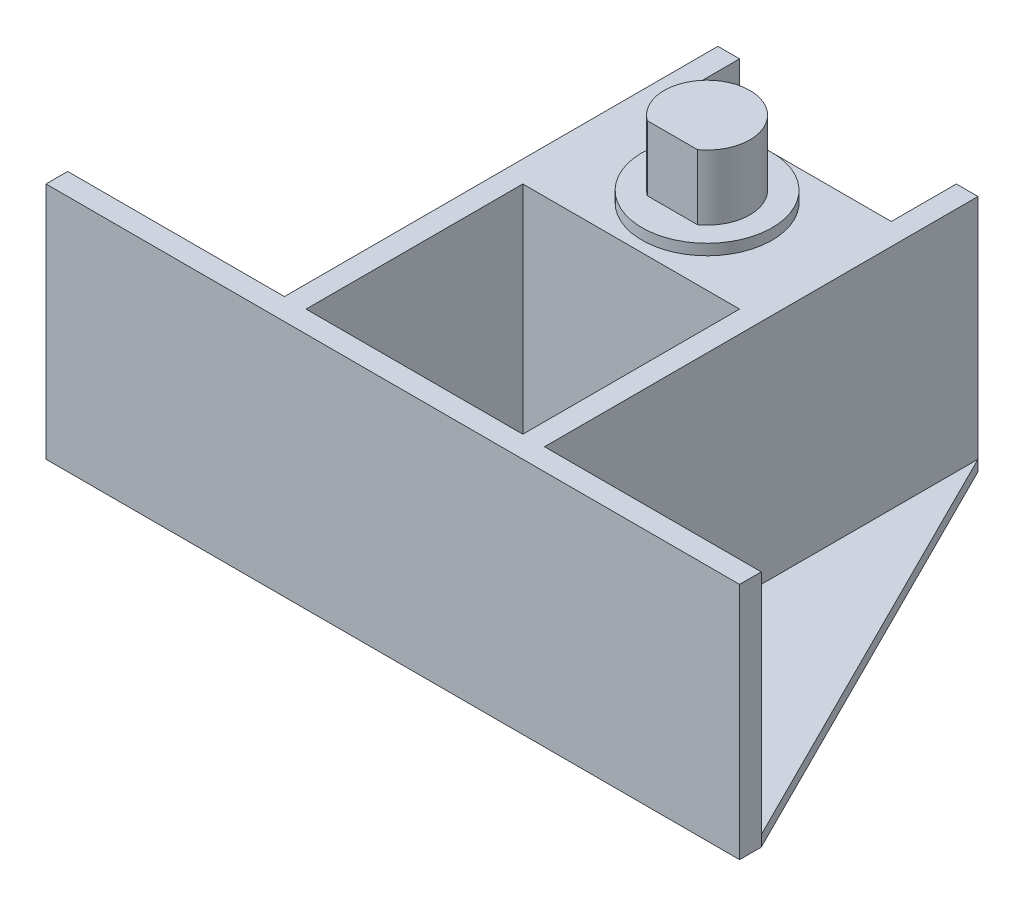
ISO-10303-21;
HEADER;
FILE_DESCRIPTION(('STEP AP214'),'2;1');
FILE_NAME('part.step','',(''),(''),'','','');
FILE_SCHEMA(('AUTOMOTIVE_DESIGN { 1 0 10303 214 1 1 1 1 }'));
ENDSEC;
DATA;
#1=APPLICATION_CONTEXT('core data for automotive mechanical design processes');
#2=APPLICATION_PROTOCOL_DEFINITION('international standard','automotive_design',2000,#1);
#3=PRODUCT_CONTEXT('',#1,'mechanical');
#4=PRODUCT('Part','Part','',(#3));
#5=PRODUCT_RELATED_PRODUCT_CATEGORY('part','',(#4));
#6=PRODUCT_DEFINITION_FORMATION('','',#4);
#7=PRODUCT_DEFINITION_CONTEXT('part definition',#1,'design');
#8=PRODUCT_DEFINITION('design','',#6,#7);
#9=PRODUCT_DEFINITION_SHAPE('','',#8);
#10=(LENGTH_UNIT() NAMED_UNIT(*) SI_UNIT(.MILLI.,.METRE.));
#11=(NAMED_UNIT(*) PLANE_ANGLE_UNIT() SI_UNIT($,.RADIAN.));
#12=(NAMED_UNIT(*) SI_UNIT($,.STERADIAN.) SOLID_ANGLE_UNIT());
#13=UNCERTAINTY_MEASURE_WITH_UNIT(LENGTH_MEASURE(1.E-05),#10,'distance_accuracy_value','');
#14=(GEOMETRIC_REPRESENTATION_CONTEXT(3) GLOBAL_UNCERTAINTY_ASSIGNED_CONTEXT((#13)) GLOBAL_UNIT_ASSIGNED_CONTEXT((#10,
#11,#12)) REPRESENTATION_CONTEXT('',''));
#15=CARTESIAN_POINT('',(0.,0.,0.));
#16=DIRECTION('',(0.,0.,1.));
#17=DIRECTION('',(1.,0.,0.));
#18=AXIS2_PLACEMENT_3D('',#15,#16,#17);
#19=CARTESIAN_POINT('',(0.,6.,0.));
#20=DIRECTION('',(0.,-1.,0.));
#21=DIRECTION('',(0.,0.,-1.));
#22=AXIS2_PLACEMENT_3D('',#19,#20,#21);
#23=CYLINDRICAL_SURFACE('',#22,3.95);
#24=CARTESIAN_POINT('',(0.,6.,0.));
#25=DIRECTION('',(0.,1.,0.));
#26=DIRECTION('',(0.,0.,1.));
#27=AXIS2_PLACEMENT_3D('',#24,#25,#26);
#28=CIRCLE('',#27,3.95);
#29=CARTESIAN_POINT('',(2.31570723538188,6.,3.2));
#30=VERTEX_POINT('',#29);
#31=CARTESIAN_POINT('',(-2.31570723538188,6.,3.2));
#32=VERTEX_POINT('',#31);
#33=EDGE_CURVE('E11',#30,#32,#28,.T.);
#34=ORIENTED_EDGE('',*,*,#33,.F.);
#35=DIRECTION('',(0.,1.,0.));
#36=VECTOR('',#35,1.);
#37=CARTESIAN_POINT('',(2.31570723538188,-4.86826457785523,3.2));
#38=LINE('',#37,#36);
#39=CARTESIAN_POINT('',(2.31570723538188,0.,3.2));
#40=VERTEX_POINT('',#39);
#41=EDGE_CURVE('E57',#40,#30,#38,.T.);
#42=ORIENTED_EDGE('',*,*,#41,.F.);
#43=CARTESIAN_POINT('',(0.,0.,0.));
#44=DIRECTION('',(0.,1.,0.));
#45=DIRECTION('',(0.,0.,1.));
#46=AXIS2_PLACEMENT_3D('',#43,#44,#45);
#47=CIRCLE('',#46,3.95);
#48=CARTESIAN_POINT('',(-2.31570723538188,0.,3.2));
#49=VERTEX_POINT('',#48);
#50=EDGE_CURVE('E38',#40,#49,#47,.T.);
#51=ORIENTED_EDGE('',*,*,#50,.T.);
#52=DIRECTION('',(0.,1.,0.));
#53=VECTOR('',#52,1.);
#54=CARTESIAN_POINT('',(-2.31570723538188,-4.86826457785523,3.2));
#55=LINE('',#54,#53);
#56=EDGE_CURVE('E238',#49,#32,#55,.T.);
#57=ORIENTED_EDGE('',*,*,#56,.T.);
#58=EDGE_LOOP('',(#34,#42,#51,#57));
#59=FACE_BOUND('',#58,.T.);
#60=ADVANCED_FACE('F35',(#59),#23,.T.);
#61=CARTESIAN_POINT('',(0.,6.,0.));
#62=DIRECTION('',(0.,1.,0.));
#63=DIRECTION('',(0.,0.,1.));
#64=AXIS2_PLACEMENT_3D('',#61,#62,#63);
#65=PLANE('',#64);
#66=DIRECTION('',(-1.,0.,0.));
#67=VECTOR('',#66,1.);
#68=CARTESIAN_POINT('',(2.31570723538188,6.,3.2));
#69=LINE('',#68,#67);
#70=EDGE_CURVE('E233',#30,#32,#69,.T.);
#71=ORIENTED_EDGE('',*,*,#70,.F.);
#72=ORIENTED_EDGE('',*,*,#33,.T.);
#73=EDGE_LOOP('',(#71,#72));
#74=FACE_BOUND('',#73,.T.);
#75=ADVANCED_FACE('F348',(#74),#65,.T.);
#76=CARTESIAN_POINT('',(0.,-1.,0.));
#77=DIRECTION('',(0.,1.,0.));
#78=DIRECTION('',(0.,0.,1.));
#79=AXIS2_PLACEMENT_3D('',#76,#77,#78);
#80=CYLINDRICAL_SURFACE('',#79,6.);
#81=CARTESIAN_POINT('',(0.,-1.,0.));
#82=DIRECTION('',(0.,-1.,0.));
#83=DIRECTION('',(0.,0.,-1.));
#84=AXIS2_PLACEMENT_3D('',#81,#82,#83);
#85=CIRCLE('',#84,6.);
#86=CARTESIAN_POINT('',(0.,-1.,-6.));
#87=VERTEX_POINT('',#86);
#88=EDGE_CURVE('E328',#87,#87,#85,.T.);
#89=ORIENTED_EDGE('',*,*,#88,.F.);
#90=EDGE_LOOP('',(#89));
#91=FACE_BOUND('',#90,.T.);
#92=CARTESIAN_POINT('',(0.,0.,0.));
#93=DIRECTION('',(0.,-1.,0.));
#94=DIRECTION('',(0.,0.,-1.));
#95=AXIS2_PLACEMENT_3D('',#92,#93,#94);
#96=CIRCLE('',#95,6.);
#97=CARTESIAN_POINT('',(0.,0.,-6.));
#98=VERTEX_POINT('',#97);
#99=EDGE_CURVE('E327',#98,#98,#96,.T.);
#100=ORIENTED_EDGE('',*,*,#99,.T.);
#101=EDGE_LOOP('',(#100));
#102=FACE_BOUND('',#101,.T.);
#103=ADVANCED_FACE('F334',(#91,#102),#80,.T.);
#104=CARTESIAN_POINT('',(0.,0.,0.));
#105=DIRECTION('',(0.,-1.,0.));
#106=DIRECTION('',(0.,0.,-1.));
#107=AXIS2_PLACEMENT_3D('',#104,#105,#106);
#108=PLANE('',#107);
#109=ORIENTED_EDGE('',*,*,#50,.F.);
#110=DIRECTION('',(-1.,0.,0.));
#111=VECTOR('',#110,1.);
#112=CARTESIAN_POINT('',(2.31570723538188,0.,3.2));
#113=LINE('',#112,#111);
#114=EDGE_CURVE('E235',#40,#49,#113,.T.);
#115=ORIENTED_EDGE('',*,*,#114,.T.);
#116=EDGE_LOOP('',(#109,#115));
#117=FACE_BOUND('',#116,.T.);
#118=ORIENTED_EDGE('',*,*,#99,.F.);
#119=EDGE_LOOP('',(#118));
#120=FACE_BOUND('',#119,.T.);
#121=ADVANCED_FACE('F336',(#117,#120),#108,.F.);
#122=CARTESIAN_POINT('',(-12.,-22.,0.));
#123=DIRECTION('',(-1.,0.,0.));
#124=DIRECTION('',(0.,0.,1.));
#125=AXIS2_PLACEMENT_3D('',#122,#123,#124);
#126=PLANE('',#125);
#127=DIRECTION('',(0.,0.,1.));
#128=VECTOR('',#127,1.);
#129=CARTESIAN_POINT('',(-12.,-1.,0.));
#130=LINE('',#129,#128);
#131=CARTESIAN_POINT('',(-12.,-1.,-13.));
#132=VERTEX_POINT('',#131);
#133=CARTESIAN_POINT('',(-12.,-1.,27.));
#134=VERTEX_POINT('',#133);
#135=EDGE_CURVE('E303',#132,#134,#130,.T.);
#136=ORIENTED_EDGE('',*,*,#135,.F.);
#137=DIRECTION('',(0.,1.,0.));
#138=VECTOR('',#137,1.);
#139=CARTESIAN_POINT('',(-12.,-22.,-13.));
#140=LINE('',#139,#138);
#141=CARTESIAN_POINT('',(-12.,-22.,-13.));
#142=VERTEX_POINT('',#141);
#143=EDGE_CURVE('E325',#142,#132,#140,.T.);
#144=ORIENTED_EDGE('',*,*,#143,.F.);
#145=DIRECTION('',(0.,0.,1.));
#146=VECTOR('',#145,1.);
#147=CARTESIAN_POINT('',(-12.,-22.,0.));
#148=LINE('',#147,#146);
#149=CARTESIAN_POINT('',(-12.,-22.,27.));
#150=VERTEX_POINT('',#149);
#151=EDGE_CURVE('E304',#142,#150,#148,.T.);
#152=ORIENTED_EDGE('',*,*,#151,.T.);
#153=DIRECTION('',(0.,1.,0.));
#154=VECTOR('',#153,1.);
#155=CARTESIAN_POINT('',(-12.,-22.,27.));
#156=LINE('',#155,#154);
#157=EDGE_CURVE('E310',#150,#134,#156,.T.);
#158=ORIENTED_EDGE('',*,*,#157,.T.);
#159=EDGE_LOOP('',(#136,#144,#152,#158));
#160=FACE_BOUND('',#159,.T.);
#161=ADVANCED_FACE('F338',(#160),#126,.T.);
#162=CARTESIAN_POINT('',(0.,-22.,-13.));
#163=DIRECTION('',(0.,0.,1.));
#164=DIRECTION('',(1.,0.,0.));
#165=AXIS2_PLACEMENT_3D('',#162,#163,#164);
#166=PLANE('',#165);
#167=DIRECTION('',(1.,0.,0.));
#168=VECTOR('',#167,1.);
#169=CARTESIAN_POINT('',(0.,-1.,-13.));
#170=LINE('',#169,#168);
#171=CARTESIAN_POINT('',(-10.,-1.,-13.));
#172=VERTEX_POINT('',#171);
#173=EDGE_CURVE('E314',#132,#172,#170,.T.);
#174=ORIENTED_EDGE('',*,*,#173,.T.);
#175=DIRECTION('',(0.,1.,0.));
#176=VECTOR('',#175,1.);
#177=CARTESIAN_POINT('',(-10.,-22.,-13.));
#178=LINE('',#177,#176);
#179=CARTESIAN_POINT('',(-10.,-22.,-13.));
#180=VERTEX_POINT('',#179);
#181=EDGE_CURVE('E278',#180,#172,#178,.T.);
#182=ORIENTED_EDGE('',*,*,#181,.F.);
#183=DIRECTION('',(1.,0.,0.));
#184=VECTOR('',#183,1.);
#185=CARTESIAN_POINT('',(-12.,-22.,-13.));
#186=LINE('',#185,#184);
#187=CARTESIAN_POINT('',(10.,-22.,-13.));
#188=VERTEX_POINT('',#187);
#189=EDGE_CURVE('E217',#180,#188,#186,.T.);
#190=ORIENTED_EDGE('',*,*,#189,.T.);
#191=DIRECTION('',(0.,1.,0.));
#192=VECTOR('',#191,1.);
#193=CARTESIAN_POINT('',(10.,-22.,-13.));
#194=LINE('',#193,#192);
#195=CARTESIAN_POINT('',(10.,-1.,-13.));
#196=VERTEX_POINT('',#195);
#197=EDGE_CURVE('E268',#188,#196,#194,.T.);
#198=ORIENTED_EDGE('',*,*,#197,.T.);
#199=CARTESIAN_POINT('',(12.,-1.,-13.));
#200=VERTEX_POINT('',#199);
#201=EDGE_CURVE('E313',#196,#200,#170,.T.);
#202=ORIENTED_EDGE('',*,*,#201,.T.);
#203=DIRECTION('',(0.,1.,0.));
#204=VECTOR('',#203,1.);
#205=CARTESIAN_POINT('',(12.,-22.,-13.));
#206=LINE('',#205,#204);
#207=CARTESIAN_POINT('',(12.,-22.,-13.));
#208=VERTEX_POINT('',#207);
#209=EDGE_CURVE('E322',#208,#200,#206,.T.);
#210=ORIENTED_EDGE('',*,*,#209,.F.);
#211=DIRECTION('',(0.,1.,0.));
#212=VECTOR('',#211,1.);
#213=CARTESIAN_POINT('',(12.,-23.,-13.));
#214=LINE('',#213,#212);
#215=CARTESIAN_POINT('',(12.,-23.,-13.));
#216=VERTEX_POINT('',#215);
#217=EDGE_CURVE('E224',#216,#208,#214,.T.);
#218=ORIENTED_EDGE('',*,*,#217,.F.);
#219=DIRECTION('',(1.,0.,0.));
#220=VECTOR('',#219,1.);
#221=CARTESIAN_POINT('',(-12.,-23.,-13.));
#222=LINE('',#221,#220);
#223=CARTESIAN_POINT('',(-12.,-23.,-13.));
#224=VERTEX_POINT('',#223);
#225=EDGE_CURVE('E204',#224,#216,#222,.T.);
#226=ORIENTED_EDGE('',*,*,#225,.F.);
#227=DIRECTION('',(0.,1.,0.));
#228=VECTOR('',#227,1.);
#229=CARTESIAN_POINT('',(-12.,-23.,-13.));
#230=LINE('',#229,#228);
#231=EDGE_CURVE('E227',#224,#142,#230,.T.);
#232=ORIENTED_EDGE('',*,*,#231,.T.);
#233=ORIENTED_EDGE('',*,*,#143,.T.);
#234=EDGE_LOOP('',(#174,#182,#190,#198,#202,#210,#218,#226,#232,#233));
#235=FACE_BOUND('',#234,.T.);
#236=ADVANCED_FACE('F345',(#235),#166,.F.);
#237=CARTESIAN_POINT('',(12.,-22.,0.));
#238=DIRECTION('',(-1.,0.,0.));
#239=DIRECTION('',(0.,0.,1.));
#240=AXIS2_PLACEMENT_3D('',#237,#238,#239);
#241=PLANE('',#240);
#242=DIRECTION('',(0.,0.,1.));
#243=VECTOR('',#242,1.);
#244=CARTESIAN_POINT('',(12.,-1.,0.));
#245=LINE('',#244,#243);
#246=CARTESIAN_POINT('',(12.,-1.,27.));
#247=VERTEX_POINT('',#246);
#248=EDGE_CURVE('E307',#200,#247,#245,.T.);
#249=ORIENTED_EDGE('',*,*,#248,.T.);
#250=DIRECTION('',(0.,1.,0.));
#251=VECTOR('',#250,1.);
#252=CARTESIAN_POINT('',(12.,-22.,27.));
#253=LINE('',#252,#251);
#254=CARTESIAN_POINT('',(12.,-22.,27.));
#255=VERTEX_POINT('',#254);
#256=EDGE_CURVE('E319',#255,#247,#253,.T.);
#257=ORIENTED_EDGE('',*,*,#256,.F.);
#258=DIRECTION('',(0.,0.,1.));
#259=VECTOR('',#258,1.);
#260=CARTESIAN_POINT('',(12.,-22.,0.));
#261=LINE('',#260,#259);
#262=EDGE_CURVE('E306',#208,#255,#261,.T.);
#263=ORIENTED_EDGE('',*,*,#262,.F.);
#264=ORIENTED_EDGE('',*,*,#209,.T.);
#265=EDGE_LOOP('',(#249,#257,#263,#264));
#266=FACE_BOUND('',#265,.T.);
#267=ADVANCED_FACE('F416',(#266),#241,.F.);
#268=CARTESIAN_POINT('',(0.,-1.,0.));
#269=DIRECTION('',(0.,-1.,0.));
#270=DIRECTION('',(0.,0.,-1.));
#271=AXIS2_PLACEMENT_3D('',#268,#269,#270);
#272=PLANE('',#271);
#273=DIRECTION('',(-1.,0.,0.));
#274=VECTOR('',#273,1.);
#275=CARTESIAN_POINT('',(10.,-1.,7.));
#276=LINE('',#275,#274);
#277=CARTESIAN_POINT('',(10.,-1.,7.));
#278=VERTEX_POINT('',#277);
#279=CARTESIAN_POINT('',(-10.,-1.,7.));
#280=VERTEX_POINT('',#279);
#281=EDGE_CURVE('E245',#278,#280,#276,.T.);
#282=ORIENTED_EDGE('',*,*,#281,.F.);
#283=DIRECTION('',(0.,0.,-1.));
#284=VECTOR('',#283,1.);
#285=CARTESIAN_POINT('',(10.,-1.,27.));
#286=LINE('',#285,#284);
#287=CARTESIAN_POINT('',(10.,-1.,27.));
#288=VERTEX_POINT('',#287);
#289=EDGE_CURVE('E243',#288,#278,#286,.T.);
#290=ORIENTED_EDGE('',*,*,#289,.F.);
#291=DIRECTION('',(1.,0.,0.));
#292=VECTOR('',#291,1.);
#293=CARTESIAN_POINT('',(10.,-1.,27.));
#294=LINE('',#293,#292);
#295=CARTESIAN_POINT('',(-10.,-1.,27.));
#296=VERTEX_POINT('',#295);
#297=EDGE_CURVE('E250',#296,#288,#294,.T.);
#298=ORIENTED_EDGE('',*,*,#297,.F.);
#299=DIRECTION('',(0.,0.,1.));
#300=VECTOR('',#299,1.);
#301=CARTESIAN_POINT('',(-10.,-1.,27.));
#302=LINE('',#301,#300);
#303=EDGE_CURVE('E178',#280,#296,#302,.T.);
#304=ORIENTED_EDGE('',*,*,#303,.F.);
#305=EDGE_LOOP('',(#282,#290,#298,#304));
#306=FACE_BOUND('',#305,.T.);
#307=ORIENTED_EDGE('',*,*,#88,.T.);
#308=EDGE_LOOP('',(#307));
#309=FACE_BOUND('',#308,.T.);
#310=ORIENTED_EDGE('',*,*,#201,.F.);
#311=DIRECTION('',(0.,0.,-1.));
#312=VECTOR('',#311,1.);
#313=CARTESIAN_POINT('',(10.,-1.,-13.));
#314=LINE('',#313,#312);
#315=CARTESIAN_POINT('',(10.,-1.,-7.));
#316=VERTEX_POINT('',#315);
#317=EDGE_CURVE('E241',#316,#196,#314,.T.);
#318=ORIENTED_EDGE('',*,*,#317,.F.);
#319=DIRECTION('',(1.,0.,0.));
#320=VECTOR('',#319,1.);
#321=CARTESIAN_POINT('',(10.,-1.,-7.));
#322=LINE('',#321,#320);
#323=CARTESIAN_POINT('',(-10.,-1.,-7.));
#324=VERTEX_POINT('',#323);
#325=EDGE_CURVE('E262',#324,#316,#322,.T.);
#326=ORIENTED_EDGE('',*,*,#325,.F.);
#327=DIRECTION('',(0.,0.,1.));
#328=VECTOR('',#327,1.);
#329=CARTESIAN_POINT('',(-10.,-1.,-13.));
#330=LINE('',#329,#328);
#331=EDGE_CURVE('E270',#172,#324,#330,.T.);
#332=ORIENTED_EDGE('',*,*,#331,.F.);
#333=ORIENTED_EDGE('',*,*,#173,.F.);
#334=ORIENTED_EDGE('',*,*,#135,.T.);
#335=DIRECTION('',(-1.,0.,0.));
#336=VECTOR('',#335,1.);
#337=CARTESIAN_POINT('',(-32.,-1.,27.));
#338=LINE('',#337,#336);
#339=CARTESIAN_POINT('',(-32.,-1.,27.));
#340=VERTEX_POINT('',#339);
#341=EDGE_CURVE('E289',#134,#340,#338,.T.);
#342=ORIENTED_EDGE('',*,*,#341,.T.);
#343=DIRECTION('',(0.,0.,1.));
#344=VECTOR('',#343,1.);
#345=CARTESIAN_POINT('',(-32.,-1.,27.));
#346=LINE('',#345,#344);
#347=CARTESIAN_POINT('',(-32.,-1.,29.));
#348=VERTEX_POINT('',#347);
#349=EDGE_CURVE('E287',#340,#348,#346,.T.);
#350=ORIENTED_EDGE('',*,*,#349,.T.);
#351=DIRECTION('',(1.,0.,0.));
#352=VECTOR('',#351,1.);
#353=CARTESIAN_POINT('',(-32.,-1.,29.));
#354=LINE('',#353,#352);
#355=CARTESIAN_POINT('',(32.,-1.,29.));
#356=VERTEX_POINT('',#355);
#357=EDGE_CURVE('E284',#348,#356,#354,.T.);
#358=ORIENTED_EDGE('',*,*,#357,.T.);
#359=DIRECTION('',(0.,0.,-1.));
#360=VECTOR('',#359,1.);
#361=CARTESIAN_POINT('',(32.,-1.,27.));
#362=LINE('',#361,#360);
#363=CARTESIAN_POINT('',(32.,-1.,27.));
#364=VERTEX_POINT('',#363);
#365=EDGE_CURVE('E282',#356,#364,#362,.T.);
#366=ORIENTED_EDGE('',*,*,#365,.T.);
#367=EDGE_CURVE('E300',#364,#247,#338,.T.);
#368=ORIENTED_EDGE('',*,*,#367,.T.);
#369=ORIENTED_EDGE('',*,*,#248,.F.);
#370=EDGE_LOOP('',(#310,#318,#326,#332,#333,#334,#342,#350,#358,#366,#368,#369));
#371=FACE_BOUND('',#370,.T.);
#372=ADVANCED_FACE('F413',(#306,#309,#371),#272,.F.);
#373=CARTESIAN_POINT('',(-32.,63.0312423743285,27.));
#374=DIRECTION('',(0.,0.,-1.));
#375=DIRECTION('',(-1.,0.,0.));
#376=AXIS2_PLACEMENT_3D('',#373,#374,#375);
#377=PLANE('',#376);
#378=ORIENTED_EDGE('',*,*,#157,.F.);
#379=DIRECTION('',(1.,0.,0.));
#380=VECTOR('',#379,1.);
#381=CARTESIAN_POINT('',(-32.,-22.,27.));
#382=LINE('',#381,#380);
#383=CARTESIAN_POINT('',(-32.,-22.,27.));
#384=VERTEX_POINT('',#383);
#385=EDGE_CURVE('E290',#384,#150,#382,.T.);
#386=ORIENTED_EDGE('',*,*,#385,.F.);
#387=DIRECTION('',(0.,-1.,0.));
#388=VECTOR('',#387,1.);
#389=CARTESIAN_POINT('',(-32.,63.0312423743285,27.));
#390=LINE('',#389,#388);
#391=EDGE_CURVE('E293',#340,#384,#390,.T.);
#392=ORIENTED_EDGE('',*,*,#391,.F.);
#393=ORIENTED_EDGE('',*,*,#341,.F.);
#394=EDGE_LOOP('',(#378,#386,#392,#393));
#395=FACE_BOUND('',#394,.T.);
#396=ADVANCED_FACE('F409',(#395),#377,.T.);
#397=CARTESIAN_POINT('',(-32.,63.0312423743285,27.));
#398=DIRECTION('',(-1.,0.,0.));
#399=DIRECTION('',(0.,0.,1.));
#400=AXIS2_PLACEMENT_3D('',#397,#398,#399);
#401=PLANE('',#400);
#402=ORIENTED_EDGE('',*,*,#349,.F.);
#403=ORIENTED_EDGE('',*,*,#391,.T.);
#404=DIRECTION('',(0.,1.,0.));
#405=VECTOR('',#404,1.);
#406=CARTESIAN_POINT('',(-32.,-23.,27.));
#407=LINE('',#406,#405);
#408=CARTESIAN_POINT('',(-32.,-23.,27.));
#409=VERTEX_POINT('',#408);
#410=EDGE_CURVE('E230',#409,#384,#407,.T.);
#411=ORIENTED_EDGE('',*,*,#410,.F.);
#412=DIRECTION('',(0.,0.,-1.));
#413=VECTOR('',#412,1.);
#414=CARTESIAN_POINT('',(-32.,-23.,29.));
#415=LINE('',#414,#413);
#416=CARTESIAN_POINT('',(-32.,-23.,29.));
#417=VERTEX_POINT('',#416);
#418=EDGE_CURVE('E198',#417,#409,#415,.T.);
#419=ORIENTED_EDGE('',*,*,#418,.F.);
#420=DIRECTION('',(0.,-1.,0.));
#421=VECTOR('',#420,1.);
#422=CARTESIAN_POINT('',(-32.,63.0312423743285,29.));
#423=LINE('',#422,#421);
#424=EDGE_CURVE('E285',#348,#417,#423,.T.);
#425=ORIENTED_EDGE('',*,*,#424,.F.);
#426=EDGE_LOOP('',(#402,#403,#411,#419,#425));
#427=FACE_BOUND('',#426,.T.);
#428=ADVANCED_FACE('F401',(#427),#401,.T.);
#429=CARTESIAN_POINT('',(-32.,63.0312423743285,29.));
#430=DIRECTION('',(0.,0.,1.));
#431=DIRECTION('',(1.,0.,0.));
#432=AXIS2_PLACEMENT_3D('',#429,#430,#431);
#433=PLANE('',#432);
#434=ORIENTED_EDGE('',*,*,#357,.F.);
#435=ORIENTED_EDGE('',*,*,#424,.T.);
#436=DIRECTION('',(-1.,0.,0.));
#437=VECTOR('',#436,1.);
#438=CARTESIAN_POINT('',(-32.,-23.,29.));
#439=LINE('',#438,#437);
#440=CARTESIAN_POINT('',(32.,-23.,29.));
#441=VERTEX_POINT('',#440);
#442=EDGE_CURVE('E211',#441,#417,#439,.T.);
#443=ORIENTED_EDGE('',*,*,#442,.F.);
#444=DIRECTION('',(0.,-1.,0.));
#445=VECTOR('',#444,1.);
#446=CARTESIAN_POINT('',(32.,63.0312423743285,29.));
#447=LINE('',#446,#445);
#448=EDGE_CURVE('E295',#356,#441,#447,.T.);
#449=ORIENTED_EDGE('',*,*,#448,.F.);
#450=EDGE_LOOP('',(#434,#435,#443,#449));
#451=FACE_BOUND('',#450,.T.);
#452=ADVANCED_FACE('F397',(#451),#433,.T.);
#453=CARTESIAN_POINT('',(32.,63.0312423743285,27.));
#454=DIRECTION('',(1.,0.,0.));
#455=DIRECTION('',(0.,0.,-1.));
#456=AXIS2_PLACEMENT_3D('',#453,#454,#455);
#457=PLANE('',#456);
#458=ORIENTED_EDGE('',*,*,#365,.F.);
#459=ORIENTED_EDGE('',*,*,#448,.T.);
#460=DIRECTION('',(0.,0.,1.));
#461=VECTOR('',#460,1.);
#462=CARTESIAN_POINT('',(32.,-23.,29.));
#463=LINE('',#462,#461);
#464=CARTESIAN_POINT('',(32.,-23.,27.));
#465=VERTEX_POINT('',#464);
#466=EDGE_CURVE('E208',#465,#441,#463,.T.);
#467=ORIENTED_EDGE('',*,*,#466,.F.);
#468=DIRECTION('',(0.,1.,0.));
#469=VECTOR('',#468,1.);
#470=CARTESIAN_POINT('',(32.,-23.,27.));
#471=LINE('',#470,#469);
#472=CARTESIAN_POINT('',(32.,-22.,27.));
#473=VERTEX_POINT('',#472);
#474=EDGE_CURVE('E214',#465,#473,#471,.T.);
#475=ORIENTED_EDGE('',*,*,#474,.T.);
#476=DIRECTION('',(0.,-1.,0.));
#477=VECTOR('',#476,1.);
#478=CARTESIAN_POINT('',(32.,63.0312423743285,27.));
#479=LINE('',#478,#477);
#480=EDGE_CURVE('E297',#364,#473,#479,.T.);
#481=ORIENTED_EDGE('',*,*,#480,.F.);
#482=EDGE_LOOP('',(#458,#459,#467,#475,#481));
#483=FACE_BOUND('',#482,.T.);
#484=ADVANCED_FACE('F400',(#483),#457,.T.);
#485=EDGE_CURVE('E253',#255,#473,#382,.T.);
#486=ORIENTED_EDGE('',*,*,#485,.F.);
#487=ORIENTED_EDGE('',*,*,#256,.T.);
#488=ORIENTED_EDGE('',*,*,#367,.F.);
#489=ORIENTED_EDGE('',*,*,#480,.T.);
#490=EDGE_LOOP('',(#486,#487,#488,#489));
#491=FACE_BOUND('',#490,.T.);
#492=ADVANCED_FACE('F395',(#491),#377,.T.);
#493=CARTESIAN_POINT('',(10.,-22.,-13.));
#494=DIRECTION('',(1.,0.,0.));
#495=DIRECTION('',(0.,0.,-1.));
#496=AXIS2_PLACEMENT_3D('',#493,#494,#495);
#497=PLANE('',#496);
#498=ORIENTED_EDGE('',*,*,#317,.T.);
#499=ORIENTED_EDGE('',*,*,#197,.F.);
#500=DIRECTION('',(0.,0.,-1.));
#501=VECTOR('',#500,1.);
#502=CARTESIAN_POINT('',(10.,-22.,-13.));
#503=LINE('',#502,#501);
#504=CARTESIAN_POINT('',(10.,-22.,-7.));
#505=VERTEX_POINT('',#504);
#506=EDGE_CURVE('E258',#505,#188,#503,.T.);
#507=ORIENTED_EDGE('',*,*,#506,.F.);
#508=DIRECTION('',(0.,1.,0.));
#509=VECTOR('',#508,1.);
#510=CARTESIAN_POINT('',(10.,-22.,-7.));
#511=LINE('',#510,#509);
#512=EDGE_CURVE('E246',#505,#316,#511,.T.);
#513=ORIENTED_EDGE('',*,*,#512,.T.);
#514=EDGE_LOOP('',(#498,#499,#507,#513));
#515=FACE_BOUND('',#514,.T.);
#516=ADVANCED_FACE('F388',(#515),#497,.F.);
#517=CARTESIAN_POINT('',(10.,-22.,-7.));
#518=DIRECTION('',(0.,0.,1.));
#519=DIRECTION('',(1.,0.,0.));
#520=AXIS2_PLACEMENT_3D('',#517,#518,#519);
#521=PLANE('',#520);
#522=ORIENTED_EDGE('',*,*,#325,.T.);
#523=ORIENTED_EDGE('',*,*,#512,.F.);
#524=DIRECTION('',(1.,0.,0.));
#525=VECTOR('',#524,1.);
#526=CARTESIAN_POINT('',(10.,-22.,-7.));
#527=LINE('',#526,#525);
#528=CARTESIAN_POINT('',(-10.,-22.,-7.));
#529=VERTEX_POINT('',#528);
#530=EDGE_CURVE('E265',#529,#505,#527,.T.);
#531=ORIENTED_EDGE('',*,*,#530,.F.);
#532=DIRECTION('',(0.,1.,0.));
#533=VECTOR('',#532,1.);
#534=CARTESIAN_POINT('',(-10.,-22.,-7.));
#535=LINE('',#534,#533);
#536=EDGE_CURVE('E276',#529,#324,#535,.T.);
#537=ORIENTED_EDGE('',*,*,#536,.T.);
#538=EDGE_LOOP('',(#522,#523,#531,#537));
#539=FACE_BOUND('',#538,.T.);
#540=ADVANCED_FACE('F385',(#539),#521,.F.);
#541=CARTESIAN_POINT('',(-10.,-22.,-13.));
#542=DIRECTION('',(-1.,0.,0.));
#543=DIRECTION('',(0.,0.,1.));
#544=AXIS2_PLACEMENT_3D('',#541,#542,#543);
#545=PLANE('',#544);
#546=ORIENTED_EDGE('',*,*,#331,.T.);
#547=ORIENTED_EDGE('',*,*,#536,.F.);
#548=DIRECTION('',(0.,0.,1.));
#549=VECTOR('',#548,1.);
#550=CARTESIAN_POINT('',(-10.,-22.,-13.));
#551=LINE('',#550,#549);
#552=EDGE_CURVE('E261',#180,#529,#551,.T.);
#553=ORIENTED_EDGE('',*,*,#552,.F.);
#554=ORIENTED_EDGE('',*,*,#181,.T.);
#555=EDGE_LOOP('',(#546,#547,#553,#554));
#556=FACE_BOUND('',#555,.T.);
#557=ADVANCED_FACE('F383',(#556),#545,.F.);
#558=CARTESIAN_POINT('',(10.,-22.,27.));
#559=DIRECTION('',(1.,0.,0.));
#560=DIRECTION('',(0.,0.,-1.));
#561=AXIS2_PLACEMENT_3D('',#558,#559,#560);
#562=PLANE('',#561);
#563=ORIENTED_EDGE('',*,*,#289,.T.);
#564=DIRECTION('',(0.,1.,0.));
#565=VECTOR('',#564,1.);
#566=CARTESIAN_POINT('',(10.,-22.,7.));
#567=LINE('',#566,#565);
#568=CARTESIAN_POINT('',(10.,-23.,7.));
#569=VERTEX_POINT('',#568);
#570=EDGE_CURVE('E252',#569,#278,#567,.T.);
#571=ORIENTED_EDGE('',*,*,#570,.F.);
#572=DIRECTION('',(0.,0.,-1.));
#573=VECTOR('',#572,1.);
#574=CARTESIAN_POINT('',(10.,-23.,27.));
#575=LINE('',#574,#573);
#576=CARTESIAN_POINT('',(10.,-23.,27.));
#577=VERTEX_POINT('',#576);
#578=EDGE_CURVE('E187',#577,#569,#575,.T.);
#579=ORIENTED_EDGE('',*,*,#578,.F.);
#580=DIRECTION('',(0.,1.,0.));
#581=VECTOR('',#580,1.);
#582=CARTESIAN_POINT('',(10.,-22.,27.));
#583=LINE('',#582,#581);
#584=EDGE_CURVE('E49',#577,#288,#583,.T.);
#585=ORIENTED_EDGE('',*,*,#584,.T.);
#586=EDGE_LOOP('',(#563,#571,#579,#585));
#587=FACE_BOUND('',#586,.T.);
#588=ADVANCED_FACE('F378',(#587),#562,.F.);
#589=CARTESIAN_POINT('',(10.,-22.,27.));
#590=DIRECTION('',(0.,0.,1.));
#591=DIRECTION('',(1.,0.,0.));
#592=AXIS2_PLACEMENT_3D('',#589,#590,#591);
#593=PLANE('',#592);
#594=ORIENTED_EDGE('',*,*,#297,.T.);
#595=ORIENTED_EDGE('',*,*,#584,.F.);
#596=DIRECTION('',(1.,0.,0.));
#597=VECTOR('',#596,1.);
#598=CARTESIAN_POINT('',(-10.,-23.,27.));
#599=LINE('',#598,#597);
#600=CARTESIAN_POINT('',(-10.,-23.,27.));
#601=VERTEX_POINT('',#600);
#602=EDGE_CURVE('E183',#601,#577,#599,.T.);
#603=ORIENTED_EDGE('',*,*,#602,.F.);
#604=DIRECTION('',(0.,1.,0.));
#605=VECTOR('',#604,1.);
#606=CARTESIAN_POINT('',(-10.,-22.,27.));
#607=LINE('',#606,#605);
#608=EDGE_CURVE('E172',#601,#296,#607,.T.);
#609=ORIENTED_EDGE('',*,*,#608,.T.);
#610=EDGE_LOOP('',(#594,#595,#603,#609));
#611=FACE_BOUND('',#610,.T.);
#612=ADVANCED_FACE('F184',(#611),#593,.F.);
#613=CARTESIAN_POINT('',(-10.,-22.,27.));
#614=DIRECTION('',(-1.,0.,0.));
#615=DIRECTION('',(0.,0.,1.));
#616=AXIS2_PLACEMENT_3D('',#613,#614,#615);
#617=PLANE('',#616);
#618=ORIENTED_EDGE('',*,*,#303,.T.);
#619=ORIENTED_EDGE('',*,*,#608,.F.);
#620=DIRECTION('',(0.,0.,1.));
#621=VECTOR('',#620,1.);
#622=CARTESIAN_POINT('',(-10.,-23.,7.));
#623=LINE('',#622,#621);
#624=CARTESIAN_POINT('',(-10.,-23.,7.));
#625=VERTEX_POINT('',#624);
#626=EDGE_CURVE('E175',#625,#601,#623,.T.);
#627=ORIENTED_EDGE('',*,*,#626,.F.);
#628=DIRECTION('',(0.,1.,0.));
#629=VECTOR('',#628,1.);
#630=CARTESIAN_POINT('',(-10.,-22.,7.));
#631=LINE('',#630,#629);
#632=EDGE_CURVE('E180',#625,#280,#631,.T.);
#633=ORIENTED_EDGE('',*,*,#632,.T.);
#634=EDGE_LOOP('',(#618,#619,#627,#633));
#635=FACE_BOUND('',#634,.T.);
#636=ADVANCED_FACE('F173',(#635),#617,.F.);
#637=CARTESIAN_POINT('',(10.,-22.,7.));
#638=DIRECTION('',(0.,0.,-1.));
#639=DIRECTION('',(-1.,0.,0.));
#640=AXIS2_PLACEMENT_3D('',#637,#638,#639);
#641=PLANE('',#640);
#642=ORIENTED_EDGE('',*,*,#281,.T.);
#643=ORIENTED_EDGE('',*,*,#632,.F.);
#644=DIRECTION('',(-1.,0.,0.));
#645=VECTOR('',#644,1.);
#646=CARTESIAN_POINT('',(10.,-23.,7.));
#647=LINE('',#646,#645);
#648=EDGE_CURVE('E192',#569,#625,#647,.T.);
#649=ORIENTED_EDGE('',*,*,#648,.F.);
#650=ORIENTED_EDGE('',*,*,#570,.T.);
#651=EDGE_LOOP('',(#642,#643,#649,#650));
#652=FACE_BOUND('',#651,.T.);
#653=ADVANCED_FACE('F362',(#652),#641,.F.);
#654=CARTESIAN_POINT('',(2.31570723538188,-4.86826457785523,3.2));
#655=DIRECTION('',(0.,0.,-1.));
#656=DIRECTION('',(-1.,0.,0.));
#657=AXIS2_PLACEMENT_3D('',#654,#655,#656);
#658=PLANE('',#657);
#659=ORIENTED_EDGE('',*,*,#41,.T.);
#660=ORIENTED_EDGE('',*,*,#70,.T.);
#661=ORIENTED_EDGE('',*,*,#56,.F.);
#662=ORIENTED_EDGE('',*,*,#114,.F.);
#663=EDGE_LOOP('',(#659,#660,#661,#662));
#664=FACE_BOUND('',#663,.T.);
#665=ADVANCED_FACE('F360',(#664),#658,.F.);
#666=CARTESIAN_POINT('',(0.,-23.,0.));
#667=DIRECTION('',(0.,-1.,0.));
#668=DIRECTION('',(0.,0.,-1.));
#669=AXIS2_PLACEMENT_3D('',#666,#667,#668);
#670=PLANE('',#669);
#671=ORIENTED_EDGE('',*,*,#626,.T.);
#672=ORIENTED_EDGE('',*,*,#602,.T.);
#673=ORIENTED_EDGE('',*,*,#578,.T.);
#674=ORIENTED_EDGE('',*,*,#648,.T.);
#675=EDGE_LOOP('',(#671,#672,#673,#674));
#676=FACE_BOUND('',#675,.T.);
#677=ORIENTED_EDGE('',*,*,#418,.T.);
#678=DIRECTION('',(0.447213595499958,0.,-0.894427190999916));
#679=VECTOR('',#678,1.);
#680=CARTESIAN_POINT('',(-12.,-23.,-13.));
#681=LINE('',#680,#679);
#682=EDGE_CURVE('E201',#409,#224,#681,.T.);
#683=ORIENTED_EDGE('',*,*,#682,.T.);
#684=ORIENTED_EDGE('',*,*,#225,.T.);
#685=DIRECTION('',(0.447213595499958,0.,0.894427190999916));
#686=VECTOR('',#685,1.);
#687=CARTESIAN_POINT('',(32.,-23.,27.));
#688=LINE('',#687,#686);
#689=EDGE_CURVE('E206',#216,#465,#688,.T.);
#690=ORIENTED_EDGE('',*,*,#689,.T.);
#691=ORIENTED_EDGE('',*,*,#466,.T.);
#692=ORIENTED_EDGE('',*,*,#442,.T.);
#693=EDGE_LOOP('',(#677,#683,#684,#690,#691,#692));
#694=FACE_BOUND('',#693,.T.);
#695=ADVANCED_FACE('F189',(#676,#694),#670,.T.);
#696=CARTESIAN_POINT('',(32.,-23.,27.));
#697=DIRECTION('',(-0.894427190999916,0.,0.447213595499958));
#698=DIRECTION('',(0.447213595499958,0.,0.894427190999916));
#699=AXIS2_PLACEMENT_3D('',#696,#697,#698);
#700=PLANE('',#699);
#701=DIRECTION('',(0.447213595499958,0.,0.894427190999916));
#702=VECTOR('',#701,1.);
#703=CARTESIAN_POINT('',(32.,-22.,27.));
#704=LINE('',#703,#702);
#705=EDGE_CURVE('E202',#208,#473,#704,.T.);
#706=ORIENTED_EDGE('',*,*,#705,.T.);
#707=ORIENTED_EDGE('',*,*,#474,.F.);
#708=ORIENTED_EDGE('',*,*,#689,.F.);
#709=ORIENTED_EDGE('',*,*,#217,.T.);
#710=EDGE_LOOP('',(#706,#707,#708,#709));
#711=FACE_BOUND('',#710,.T.);
#712=ADVANCED_FACE('F368',(#711),#700,.F.);
#713=CARTESIAN_POINT('',(-12.,-23.,-13.));
#714=DIRECTION('',(0.894427190999916,0.,0.447213595499958));
#715=DIRECTION('',(0.447213595499958,0.,-0.894427190999916));
#716=AXIS2_PLACEMENT_3D('',#713,#714,#715);
#717=PLANE('',#716);
#718=DIRECTION('',(0.447213595499958,0.,-0.894427190999916));
#719=VECTOR('',#718,1.);
#720=CARTESIAN_POINT('',(-12.,-22.,-13.));
#721=LINE('',#720,#719);
#722=EDGE_CURVE('E197',#384,#142,#721,.T.);
#723=ORIENTED_EDGE('',*,*,#722,.T.);
#724=ORIENTED_EDGE('',*,*,#231,.F.);
#725=ORIENTED_EDGE('',*,*,#682,.F.);
#726=ORIENTED_EDGE('',*,*,#410,.T.);
#727=EDGE_LOOP('',(#723,#724,#725,#726));
#728=FACE_BOUND('',#727,.T.);
#729=ADVANCED_FACE('F374',(#728),#717,.F.);
#730=CARTESIAN_POINT('',(0.,-22.,0.));
#731=DIRECTION('',(0.,-1.,0.));
#732=DIRECTION('',(0.,0.,-1.));
#733=AXIS2_PLACEMENT_3D('',#730,#731,#732);
#734=PLANE('',#733);
#735=ORIENTED_EDGE('',*,*,#530,.T.);
#736=ORIENTED_EDGE('',*,*,#506,.T.);
#737=ORIENTED_EDGE('',*,*,#189,.F.);
#738=ORIENTED_EDGE('',*,*,#552,.T.);
#739=EDGE_LOOP('',(#735,#736,#737,#738));
#740=FACE_BOUND('',#739,.T.);
#741=ADVANCED_FACE('F468',(#740),#734,.F.);
#742=ORIENTED_EDGE('',*,*,#722,.F.);
#743=ORIENTED_EDGE('',*,*,#385,.T.);
#744=ORIENTED_EDGE('',*,*,#151,.F.);
#745=EDGE_LOOP('',(#742,#743,#744));
#746=FACE_BOUND('',#745,.T.);
#747=ADVANCED_FACE('F441',(#746),#734,.F.);
#748=ORIENTED_EDGE('',*,*,#705,.F.);
#749=ORIENTED_EDGE('',*,*,#262,.T.);
#750=ORIENTED_EDGE('',*,*,#485,.T.);
#751=EDGE_LOOP('',(#748,#749,#750));
#752=FACE_BOUND('',#751,.T.);
#753=ADVANCED_FACE('F472',(#752),#734,.F.);
#754=CLOSED_SHELL('',(#60,#75,#103,#121,#161,#236,#267,#372,#396,#428,#452,#484,#492,#516,#540,
#557,#588,#612,#636,#653,#665,#695,#712,#729,#741,#747,#753));
#755=MANIFOLD_SOLID_BREP('B2',#754);
#756=ADVANCED_BREP_SHAPE_REPRESENTATION('',(#18,#755),#14);
#757=SHAPE_DEFINITION_REPRESENTATION(#9,#756);
ENDSEC;
END-ISO-10303-21;
